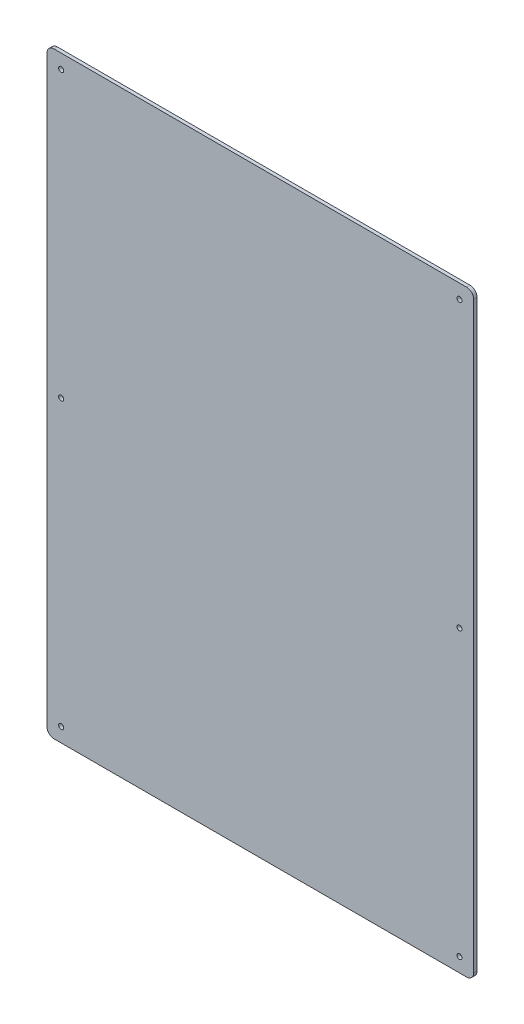
ISO-10303-21;
HEADER;
FILE_DESCRIPTION(('STEP AP214'),'2;1');
FILE_NAME('part.step','',(''),(''),'','','');
FILE_SCHEMA(('AUTOMOTIVE_DESIGN { 1 0 10303 214 1 1 1 1 }'));
ENDSEC;
DATA;
#1=APPLICATION_CONTEXT('core data for automotive mechanical design processes');
#2=APPLICATION_PROTOCOL_DEFINITION('international standard','automotive_design',2000,#1);
#3=PRODUCT_CONTEXT('',#1,'mechanical');
#4=PRODUCT('Part','Part','',(#3));
#5=PRODUCT_RELATED_PRODUCT_CATEGORY('part','',(#4));
#6=PRODUCT_DEFINITION_FORMATION('','',#4);
#7=PRODUCT_DEFINITION_CONTEXT('part definition',#1,'design');
#8=PRODUCT_DEFINITION('design','',#6,#7);
#9=PRODUCT_DEFINITION_SHAPE('','',#8);
#10=(LENGTH_UNIT() NAMED_UNIT(*) SI_UNIT(.MILLI.,.METRE.));
#11=(NAMED_UNIT(*) PLANE_ANGLE_UNIT() SI_UNIT($,.RADIAN.));
#12=(NAMED_UNIT(*) SI_UNIT($,.STERADIAN.) SOLID_ANGLE_UNIT());
#13=UNCERTAINTY_MEASURE_WITH_UNIT(LENGTH_MEASURE(1.E-05),#10,'distance_accuracy_value','');
#14=(GEOMETRIC_REPRESENTATION_CONTEXT(3) GLOBAL_UNCERTAINTY_ASSIGNED_CONTEXT((#13)) GLOBAL_UNIT_ASSIGNED_CONTEXT((#10,
#11,#12)) REPRESENTATION_CONTEXT('',''));
#15=CARTESIAN_POINT('',(0.,0.,0.));
#16=DIRECTION('',(0.,0.,1.));
#17=DIRECTION('',(1.,0.,0.));
#18=AXIS2_PLACEMENT_3D('',#15,#16,#17);
#19=CARTESIAN_POINT('',(-8.93704227221994,7.193965099171,3.048));
#20=DIRECTION('',(1.,0.,0.));
#21=DIRECTION('',(0.,1.,0.));
#22=AXIS2_PLACEMENT_3D('',#19,#20,#21);
#23=PLANE('',#22);
#24=DIRECTION('',(0.,-1.,0.));
#25=VECTOR('',#24,1.);
#26=CARTESIAN_POINT('',(-8.93704227221994,7.193965099171,0.));
#27=LINE('',#26,#25);
#28=CARTESIAN_POINT('',(-8.93704227221994,0.843965099170999,0.));
#29=VERTEX_POINT('',#28);
#30=CARTESIAN_POINT('',(-8.93704227221988,-519.856034900829,0.));
#31=VERTEX_POINT('',#30);
#32=EDGE_CURVE('E133',#29,#31,#27,.T.);
#33=ORIENTED_EDGE('',*,*,#32,.T.);
#34=DIRECTION('',(0.,0.,-1.));
#35=VECTOR('',#34,1.);
#36=CARTESIAN_POINT('',(-8.93704227221988,-519.856034900829,3.048));
#37=LINE('',#36,#35);
#38=CARTESIAN_POINT('',(-8.93704227221988,-519.856034900829,3.048));
#39=VERTEX_POINT('',#38);
#40=EDGE_CURVE('E111',#31,#39,#37,.F.);
#41=ORIENTED_EDGE('',*,*,#40,.T.);
#42=DIRECTION('',(0.,-1.,0.));
#43=VECTOR('',#42,1.);
#44=CARTESIAN_POINT('',(-8.93704227221994,7.193965099171,3.048));
#45=LINE('',#44,#43);
#46=CARTESIAN_POINT('',(-8.93704227221994,0.843965099170999,3.048));
#47=VERTEX_POINT('',#46);
#48=EDGE_CURVE('E143',#47,#39,#45,.T.);
#49=ORIENTED_EDGE('',*,*,#48,.F.);
#50=DIRECTION('',(0.,0.,-1.));
#51=VECTOR('',#50,1.);
#52=CARTESIAN_POINT('',(-8.93704227221994,0.843965099170999,3.048));
#53=LINE('',#52,#51);
#54=EDGE_CURVE('E116',#47,#29,#53,.T.);
#55=ORIENTED_EDGE('',*,*,#54,.T.);
#56=EDGE_LOOP('',(#33,#41,#49,#55));
#57=FACE_BOUND('',#56,.T.);
#58=ADVANCED_FACE('F38',(#57),#23,.F.);
#59=CARTESIAN_POINT('',(-8.93704227221988,-526.206034900829,3.048));
#60=DIRECTION('',(0.,1.,0.));
#61=DIRECTION('',(0.,0.,1.));
#62=AXIS2_PLACEMENT_3D('',#59,#60,#61);
#63=PLANE('',#62);
#64=DIRECTION('',(1.,0.,0.));
#65=VECTOR('',#64,1.);
#66=CARTESIAN_POINT('',(-8.93704227221988,-526.206034900829,3.048));
#67=LINE('',#66,#65);
#68=CARTESIAN_POINT('',(-2.58704227221988,-526.206034900829,3.048));
#69=VERTEX_POINT('',#68);
#70=CARTESIAN_POINT('',(365.71295772778,-526.206034900829,3.048));
#71=VERTEX_POINT('',#70);
#72=EDGE_CURVE('E126',#69,#71,#67,.T.);
#73=ORIENTED_EDGE('',*,*,#72,.F.);
#74=DIRECTION('',(0.,0.,-1.));
#75=VECTOR('',#74,1.);
#76=CARTESIAN_POINT('',(-2.58704227221988,-526.206034900829,3.048));
#77=LINE('',#76,#75);
#78=CARTESIAN_POINT('',(-2.58704227221988,-526.206034900829,0.));
#79=VERTEX_POINT('',#78);
#80=EDGE_CURVE('E110',#69,#79,#77,.T.);
#81=ORIENTED_EDGE('',*,*,#80,.T.);
#82=DIRECTION('',(1.,0.,0.));
#83=VECTOR('',#82,1.);
#84=CARTESIAN_POINT('',(-8.93704227221988,-526.206034900829,0.));
#85=LINE('',#84,#83);
#86=CARTESIAN_POINT('',(365.71295772778,-526.206034900829,0.));
#87=VERTEX_POINT('',#86);
#88=EDGE_CURVE('E123',#79,#87,#85,.T.);
#89=ORIENTED_EDGE('',*,*,#88,.T.);
#90=DIRECTION('',(0.,0.,-1.));
#91=VECTOR('',#90,1.);
#92=CARTESIAN_POINT('',(365.71295772778,-526.206034900829,3.048));
#93=LINE('',#92,#91);
#94=EDGE_CURVE('E128',#87,#71,#93,.F.);
#95=ORIENTED_EDGE('',*,*,#94,.T.);
#96=EDGE_LOOP('',(#73,#81,#89,#95));
#97=FACE_BOUND('',#96,.T.);
#98=ADVANCED_FACE('F122',(#97),#63,.F.);
#99=CARTESIAN_POINT('',(372.06295772778,7.193965099171,3.048));
#100=DIRECTION('',(-1.,0.,0.));
#101=DIRECTION('',(0.,-1.,0.));
#102=AXIS2_PLACEMENT_3D('',#99,#100,#101);
#103=PLANE('',#102);
#104=DIRECTION('',(0.,1.,0.));
#105=VECTOR('',#104,1.);
#106=CARTESIAN_POINT('',(372.06295772778,7.193965099171,3.048));
#107=LINE('',#106,#105);
#108=CARTESIAN_POINT('',(372.06295772778,-519.856034900829,3.048));
#109=VERTEX_POINT('',#108);
#110=CARTESIAN_POINT('',(372.06295772778,0.843965099171001,3.048));
#111=VERTEX_POINT('',#110);
#112=EDGE_CURVE('E204',#109,#111,#107,.T.);
#113=ORIENTED_EDGE('',*,*,#112,.F.);
#114=DIRECTION('',(0.,0.,-1.));
#115=VECTOR('',#114,1.);
#116=CARTESIAN_POINT('',(372.06295772778,-519.856034900829,3.048));
#117=LINE('',#116,#115);
#118=CARTESIAN_POINT('',(372.06295772778,-519.856034900829,0.));
#119=VERTEX_POINT('',#118);
#120=EDGE_CURVE('E162',#109,#119,#117,.T.);
#121=ORIENTED_EDGE('',*,*,#120,.T.);
#122=DIRECTION('',(0.,1.,0.));
#123=VECTOR('',#122,1.);
#124=CARTESIAN_POINT('',(372.06295772778,7.193965099171,0.));
#125=LINE('',#124,#123);
#126=CARTESIAN_POINT('',(372.06295772778,0.843965099171001,0.));
#127=VERTEX_POINT('',#126);
#128=EDGE_CURVE('E132',#119,#127,#125,.T.);
#129=ORIENTED_EDGE('',*,*,#128,.T.);
#130=DIRECTION('',(0.,0.,-1.));
#131=VECTOR('',#130,1.);
#132=CARTESIAN_POINT('',(372.06295772778,0.843965099171001,3.048));
#133=LINE('',#132,#131);
#134=EDGE_CURVE('E160',#127,#111,#133,.F.);
#135=ORIENTED_EDGE('',*,*,#134,.T.);
#136=EDGE_LOOP('',(#113,#121,#129,#135));
#137=FACE_BOUND('',#136,.T.);
#138=ADVANCED_FACE('F219',(#137),#103,.F.);
#139=CARTESIAN_POINT('',(-8.93704227221994,7.193965099171,3.048));
#140=DIRECTION('',(0.,-1.,0.));
#141=DIRECTION('',(0.,0.,-1.));
#142=AXIS2_PLACEMENT_3D('',#139,#140,#141);
#143=PLANE('',#142);
#144=DIRECTION('',(-1.,0.,0.));
#145=VECTOR('',#144,1.);
#146=CARTESIAN_POINT('',(-8.93704227221994,7.193965099171,3.048));
#147=LINE('',#146,#145);
#148=CARTESIAN_POINT('',(365.71295772778,7.193965099171,3.048));
#149=VERTEX_POINT('',#148);
#150=CARTESIAN_POINT('',(-2.58704227221994,7.193965099171,3.048));
#151=VERTEX_POINT('',#150);
#152=EDGE_CURVE('E144',#149,#151,#147,.T.);
#153=ORIENTED_EDGE('',*,*,#152,.F.);
#154=DIRECTION('',(0.,0.,-1.));
#155=VECTOR('',#154,1.);
#156=CARTESIAN_POINT('',(365.71295772778,7.193965099171,3.048));
#157=LINE('',#156,#155);
#158=CARTESIAN_POINT('',(365.71295772778,7.193965099171,0.));
#159=VERTEX_POINT('',#158);
#160=EDGE_CURVE('E11',#149,#159,#157,.T.);
#161=ORIENTED_EDGE('',*,*,#160,.T.);
#162=DIRECTION('',(-1.,0.,0.));
#163=VECTOR('',#162,1.);
#164=CARTESIAN_POINT('',(-8.93704227221994,7.193965099171,0.));
#165=LINE('',#164,#163);
#166=CARTESIAN_POINT('',(-2.58704227221994,7.193965099171,0.));
#167=VERTEX_POINT('',#166);
#168=EDGE_CURVE('E136',#159,#167,#165,.T.);
#169=ORIENTED_EDGE('',*,*,#168,.T.);
#170=DIRECTION('',(0.,0.,-1.));
#171=VECTOR('',#170,1.);
#172=CARTESIAN_POINT('',(-2.58704227221994,7.193965099171,3.048));
#173=LINE('',#172,#171);
#174=EDGE_CURVE('E47',#167,#151,#173,.F.);
#175=ORIENTED_EDGE('',*,*,#174,.T.);
#176=EDGE_LOOP('',(#153,#161,#169,#175));
#177=FACE_BOUND('',#176,.T.);
#178=ADVANCED_FACE('F213',(#177),#143,.F.);
#179=CARTESIAN_POINT('',(0.,0.,3.048));
#180=DIRECTION('',(0.,0.,1.));
#181=DIRECTION('',(1.,0.,0.));
#182=AXIS2_PLACEMENT_3D('',#179,#180,#181);
#183=PLANE('',#182);
#184=CARTESIAN_POINT('',(3.76295772778018,-5.506034900829,3.048));
#185=DIRECTION('',(0.,0.,1.));
#186=DIRECTION('',(1.,0.,0.));
#187=AXIS2_PLACEMENT_3D('',#184,#185,#186);
#188=CIRCLE('',#187,2.2479);
#189=CARTESIAN_POINT('',(6.01085772778018,-5.506034900829,3.048));
#190=VERTEX_POINT('',#189);
#191=EDGE_CURVE('E184',#190,#190,#188,.T.);
#192=ORIENTED_EDGE('',*,*,#191,.F.);
#193=EDGE_LOOP('',(#192));
#194=FACE_BOUND('',#193,.T.);
#195=CARTESIAN_POINT('',(3.76295772778021,-259.506034900829,3.048));
#196=DIRECTION('',(0.,0.,1.));
#197=DIRECTION('',(1.,0.,0.));
#198=AXIS2_PLACEMENT_3D('',#195,#196,#197);
#199=CIRCLE('',#198,2.2479);
#200=CARTESIAN_POINT('',(6.01085772778021,-259.506034900829,3.048));
#201=VERTEX_POINT('',#200);
#202=EDGE_CURVE('E173',#201,#201,#199,.T.);
#203=ORIENTED_EDGE('',*,*,#202,.F.);
#204=EDGE_LOOP('',(#203));
#205=FACE_BOUND('',#204,.T.);
#206=CARTESIAN_POINT('',(3.76295772778024,-513.506034900829,3.048));
#207=DIRECTION('',(0.,0.,1.));
#208=DIRECTION('',(1.,0.,0.));
#209=AXIS2_PLACEMENT_3D('',#206,#207,#208);
#210=CIRCLE('',#209,2.2479);
#211=CARTESIAN_POINT('',(6.01085772778024,-513.506034900829,3.048));
#212=VERTEX_POINT('',#211);
#213=EDGE_CURVE('E172',#212,#212,#210,.T.);
#214=ORIENTED_EDGE('',*,*,#213,.F.);
#215=EDGE_LOOP('',(#214));
#216=FACE_BOUND('',#215,.T.);
#217=CARTESIAN_POINT('',(359.36295772778,-513.506034900829,3.048));
#218=DIRECTION('',(0.,0.,1.));
#219=DIRECTION('',(1.,0.,0.));
#220=AXIS2_PLACEMENT_3D('',#217,#218,#219);
#221=CIRCLE('',#220,2.24790000000002);
#222=CARTESIAN_POINT('',(361.61085772778,-513.506034900829,3.048));
#223=VERTEX_POINT('',#222);
#224=EDGE_CURVE('E169',#223,#223,#221,.T.);
#225=ORIENTED_EDGE('',*,*,#224,.F.);
#226=EDGE_LOOP('',(#225));
#227=FACE_BOUND('',#226,.T.);
#228=CARTESIAN_POINT('',(359.36295772778,-259.506034900829,3.048));
#229=DIRECTION('',(0.,0.,1.));
#230=DIRECTION('',(1.,0.,0.));
#231=AXIS2_PLACEMENT_3D('',#228,#229,#230);
#232=CIRCLE('',#231,2.24790000000002);
#233=CARTESIAN_POINT('',(361.61085772778,-259.506034900829,3.048));
#234=VERTEX_POINT('',#233);
#235=EDGE_CURVE('E168',#234,#234,#232,.T.);
#236=ORIENTED_EDGE('',*,*,#235,.F.);
#237=EDGE_LOOP('',(#236));
#238=FACE_BOUND('',#237,.T.);
#239=CARTESIAN_POINT('',(359.36295772778,-5.506034900829,3.048));
#240=DIRECTION('',(0.,0.,1.));
#241=DIRECTION('',(1.,0.,0.));
#242=AXIS2_PLACEMENT_3D('',#239,#240,#241);
#243=CIRCLE('',#242,2.24790000000002);
#244=CARTESIAN_POINT('',(361.61085772778,-5.506034900829,3.048));
#245=VERTEX_POINT('',#244);
#246=EDGE_CURVE('E196',#245,#245,#243,.T.);
#247=ORIENTED_EDGE('',*,*,#246,.F.);
#248=EDGE_LOOP('',(#247));
#249=FACE_BOUND('',#248,.T.);
#250=ORIENTED_EDGE('',*,*,#48,.T.);
#251=CARTESIAN_POINT('',(-2.58704227221988,-519.856034900829,3.048));
#252=DIRECTION('',(0.,0.,1.));
#253=DIRECTION('',(1.,0.,0.));
#254=AXIS2_PLACEMENT_3D('',#251,#252,#253);
#255=CIRCLE('',#254,6.35);
#256=EDGE_CURVE('E158',#39,#69,#255,.T.);
#257=ORIENTED_EDGE('',*,*,#256,.T.);
#258=ORIENTED_EDGE('',*,*,#72,.T.);
#259=CARTESIAN_POINT('',(365.71295772778,-519.856034900829,3.048));
#260=DIRECTION('',(0.,0.,1.));
#261=DIRECTION('',(1.,0.,0.));
#262=AXIS2_PLACEMENT_3D('',#259,#260,#261);
#263=CIRCLE('',#262,6.35);
#264=EDGE_CURVE('E156',#71,#109,#263,.T.);
#265=ORIENTED_EDGE('',*,*,#264,.T.);
#266=ORIENTED_EDGE('',*,*,#112,.T.);
#267=CARTESIAN_POINT('',(365.71295772778,0.843965099171,3.048));
#268=DIRECTION('',(0.,0.,1.));
#269=DIRECTION('',(1.,0.,0.));
#270=AXIS2_PLACEMENT_3D('',#267,#268,#269);
#271=CIRCLE('',#270,6.35);
#272=EDGE_CURVE('E61',#111,#149,#271,.T.);
#273=ORIENTED_EDGE('',*,*,#272,.T.);
#274=ORIENTED_EDGE('',*,*,#152,.T.);
#275=CARTESIAN_POINT('',(-2.58704227221994,0.843965099171,3.048));
#276=DIRECTION('',(0.,0.,1.));
#277=DIRECTION('',(1.,0.,0.));
#278=AXIS2_PLACEMENT_3D('',#275,#276,#277);
#279=CIRCLE('',#278,6.35);
#280=EDGE_CURVE('E153',#151,#47,#279,.T.);
#281=ORIENTED_EDGE('',*,*,#280,.T.);
#282=EDGE_LOOP('',(#250,#257,#258,#265,#266,#273,#274,#281));
#283=FACE_BOUND('',#282,.T.);
#284=ADVANCED_FACE('F206',(#194,#205,#216,#227,#238,#249,#283),#183,.T.);
#285=CARTESIAN_POINT('',(0.,0.,0.));
#286=DIRECTION('',(0.,0.,1.));
#287=DIRECTION('',(1.,0.,0.));
#288=AXIS2_PLACEMENT_3D('',#285,#286,#287);
#289=PLANE('',#288);
#290=CARTESIAN_POINT('',(3.76295772778018,-5.506034900829,0.));
#291=DIRECTION('',(0.,0.,1.));
#292=DIRECTION('',(1.,0.,0.));
#293=AXIS2_PLACEMENT_3D('',#290,#291,#292);
#294=CIRCLE('',#293,2.2479);
#295=CARTESIAN_POINT('',(6.01085772778018,-5.506034900829,0.));
#296=VERTEX_POINT('',#295);
#297=EDGE_CURVE('E42',#296,#296,#294,.T.);
#298=ORIENTED_EDGE('',*,*,#297,.T.);
#299=EDGE_LOOP('',(#298));
#300=FACE_BOUND('',#299,.T.);
#301=CARTESIAN_POINT('',(3.76295772778021,-259.506034900829,0.));
#302=DIRECTION('',(0.,0.,1.));
#303=DIRECTION('',(1.,0.,0.));
#304=AXIS2_PLACEMENT_3D('',#301,#302,#303);
#305=CIRCLE('',#304,2.2479);
#306=CARTESIAN_POINT('',(6.01085772778021,-259.506034900829,0.));
#307=VERTEX_POINT('',#306);
#308=EDGE_CURVE('E170',#307,#307,#305,.T.);
#309=ORIENTED_EDGE('',*,*,#308,.T.);
#310=EDGE_LOOP('',(#309));
#311=FACE_BOUND('',#310,.T.);
#312=CARTESIAN_POINT('',(3.76295772778024,-513.506034900829,0.));
#313=DIRECTION('',(0.,0.,1.));
#314=DIRECTION('',(1.,0.,0.));
#315=AXIS2_PLACEMENT_3D('',#312,#313,#314);
#316=CIRCLE('',#315,2.2479);
#317=CARTESIAN_POINT('',(6.01085772778024,-513.506034900829,0.));
#318=VERTEX_POINT('',#317);
#319=EDGE_CURVE('E177',#318,#318,#316,.T.);
#320=ORIENTED_EDGE('',*,*,#319,.T.);
#321=EDGE_LOOP('',(#320));
#322=FACE_BOUND('',#321,.T.);
#323=CARTESIAN_POINT('',(359.36295772778,-513.506034900829,0.));
#324=DIRECTION('',(0.,0.,1.));
#325=DIRECTION('',(1.,0.,0.));
#326=AXIS2_PLACEMENT_3D('',#323,#324,#325);
#327=CIRCLE('',#326,2.24790000000002);
#328=CARTESIAN_POINT('',(361.61085772778,-513.506034900829,0.));
#329=VERTEX_POINT('',#328);
#330=EDGE_CURVE('E166',#329,#329,#327,.T.);
#331=ORIENTED_EDGE('',*,*,#330,.T.);
#332=EDGE_LOOP('',(#331));
#333=FACE_BOUND('',#332,.T.);
#334=CARTESIAN_POINT('',(359.36295772778,-259.506034900829,0.));
#335=DIRECTION('',(0.,0.,1.));
#336=DIRECTION('',(1.,0.,0.));
#337=AXIS2_PLACEMENT_3D('',#334,#335,#336);
#338=CIRCLE('',#337,2.24790000000002);
#339=CARTESIAN_POINT('',(361.61085772778,-259.506034900829,0.));
#340=VERTEX_POINT('',#339);
#341=EDGE_CURVE('E193',#340,#340,#338,.T.);
#342=ORIENTED_EDGE('',*,*,#341,.T.);
#343=EDGE_LOOP('',(#342));
#344=FACE_BOUND('',#343,.T.);
#345=CARTESIAN_POINT('',(359.36295772778,-5.506034900829,0.));
#346=DIRECTION('',(0.,0.,1.));
#347=DIRECTION('',(1.,0.,0.));
#348=AXIS2_PLACEMENT_3D('',#345,#346,#347);
#349=CIRCLE('',#348,2.24790000000002);
#350=CARTESIAN_POINT('',(361.61085772778,-5.506034900829,0.));
#351=VERTEX_POINT('',#350);
#352=EDGE_CURVE('E138',#351,#351,#349,.T.);
#353=ORIENTED_EDGE('',*,*,#352,.T.);
#354=EDGE_LOOP('',(#353));
#355=FACE_BOUND('',#354,.T.);
#356=ORIENTED_EDGE('',*,*,#88,.F.);
#357=CARTESIAN_POINT('',(-2.58704227221988,-519.856034900829,0.));
#358=DIRECTION('',(0.,0.,1.));
#359=DIRECTION('',(1.,0.,0.));
#360=AXIS2_PLACEMENT_3D('',#357,#358,#359);
#361=CIRCLE('',#360,6.35);
#362=EDGE_CURVE('E106',#79,#31,#361,.F.);
#363=ORIENTED_EDGE('',*,*,#362,.T.);
#364=ORIENTED_EDGE('',*,*,#32,.F.);
#365=CARTESIAN_POINT('',(-2.58704227221994,0.843965099171,0.));
#366=DIRECTION('',(0.,0.,1.));
#367=DIRECTION('',(1.,0.,0.));
#368=AXIS2_PLACEMENT_3D('',#365,#366,#367);
#369=CIRCLE('',#368,6.35);
#370=EDGE_CURVE('E127',#29,#167,#369,.F.);
#371=ORIENTED_EDGE('',*,*,#370,.T.);
#372=ORIENTED_EDGE('',*,*,#168,.F.);
#373=CARTESIAN_POINT('',(365.71295772778,0.843965099171,0.));
#374=DIRECTION('',(0.,0.,1.));
#375=DIRECTION('',(1.,0.,0.));
#376=AXIS2_PLACEMENT_3D('',#373,#374,#375);
#377=CIRCLE('',#376,6.35);
#378=EDGE_CURVE('E147',#159,#127,#377,.F.);
#379=ORIENTED_EDGE('',*,*,#378,.T.);
#380=ORIENTED_EDGE('',*,*,#128,.F.);
#381=CARTESIAN_POINT('',(365.71295772778,-519.856034900829,0.));
#382=DIRECTION('',(0.,0.,1.));
#383=DIRECTION('',(1.,0.,0.));
#384=AXIS2_PLACEMENT_3D('',#381,#382,#383);
#385=CIRCLE('',#384,6.35);
#386=EDGE_CURVE('E117',#119,#87,#385,.F.);
#387=ORIENTED_EDGE('',*,*,#386,.T.);
#388=EDGE_LOOP('',(#356,#363,#364,#371,#372,#379,#380,#387));
#389=FACE_BOUND('',#388,.T.);
#390=ADVANCED_FACE('F130',(#300,#311,#322,#333,#344,#355,#389),#289,.F.);
#391=CARTESIAN_POINT('',(-2.58704227221988,-519.856034900829,3.048));
#392=DIRECTION('',(0.,0.,-1.));
#393=DIRECTION('',(-1.,0.,0.));
#394=AXIS2_PLACEMENT_3D('',#391,#392,#393);
#395=CYLINDRICAL_SURFACE('',#394,6.35);
#396=ORIENTED_EDGE('',*,*,#256,.F.);
#397=ORIENTED_EDGE('',*,*,#40,.F.);
#398=ORIENTED_EDGE('',*,*,#362,.F.);
#399=ORIENTED_EDGE('',*,*,#80,.F.);
#400=EDGE_LOOP('',(#396,#397,#398,#399));
#401=FACE_BOUND('',#400,.T.);
#402=ADVANCED_FACE('F109',(#401),#395,.T.);
#403=CARTESIAN_POINT('',(365.71295772778,-519.856034900829,3.048));
#404=DIRECTION('',(0.,0.,-1.));
#405=DIRECTION('',(-1.,0.,0.));
#406=AXIS2_PLACEMENT_3D('',#403,#404,#405);
#407=CYLINDRICAL_SURFACE('',#406,6.35);
#408=ORIENTED_EDGE('',*,*,#264,.F.);
#409=ORIENTED_EDGE('',*,*,#94,.F.);
#410=ORIENTED_EDGE('',*,*,#386,.F.);
#411=ORIENTED_EDGE('',*,*,#120,.F.);
#412=EDGE_LOOP('',(#408,#409,#410,#411));
#413=FACE_BOUND('',#412,.T.);
#414=ADVANCED_FACE('F223',(#413),#407,.T.);
#415=CARTESIAN_POINT('',(365.71295772778,0.843965099171,3.048));
#416=DIRECTION('',(0.,0.,-1.));
#417=DIRECTION('',(-1.,0.,0.));
#418=AXIS2_PLACEMENT_3D('',#415,#416,#417);
#419=CYLINDRICAL_SURFACE('',#418,6.35);
#420=ORIENTED_EDGE('',*,*,#272,.F.);
#421=ORIENTED_EDGE('',*,*,#134,.F.);
#422=ORIENTED_EDGE('',*,*,#378,.F.);
#423=ORIENTED_EDGE('',*,*,#160,.F.);
#424=EDGE_LOOP('',(#420,#421,#422,#423));
#425=FACE_BOUND('',#424,.T.);
#426=ADVANCED_FACE('F215',(#425),#419,.T.);
#427=CARTESIAN_POINT('',(-2.58704227221994,0.843965099171,3.048));
#428=DIRECTION('',(0.,0.,-1.));
#429=DIRECTION('',(-1.,0.,0.));
#430=AXIS2_PLACEMENT_3D('',#427,#428,#429);
#431=CYLINDRICAL_SURFACE('',#430,6.35);
#432=ORIENTED_EDGE('',*,*,#280,.F.);
#433=ORIENTED_EDGE('',*,*,#174,.F.);
#434=ORIENTED_EDGE('',*,*,#370,.F.);
#435=ORIENTED_EDGE('',*,*,#54,.F.);
#436=EDGE_LOOP('',(#432,#433,#434,#435));
#437=FACE_BOUND('',#436,.T.);
#438=ADVANCED_FACE('F40',(#437),#431,.T.);
#439=CARTESIAN_POINT('',(359.36295772778,-5.506034900829,3.048));
#440=DIRECTION('',(0.,0.,1.));
#441=DIRECTION('',(1.,0.,0.));
#442=AXIS2_PLACEMENT_3D('',#439,#440,#441);
#443=CYLINDRICAL_SURFACE('',#442,2.24790000000002);
#444=ORIENTED_EDGE('',*,*,#246,.T.);
#445=EDGE_LOOP('',(#444));
#446=FACE_BOUND('',#445,.T.);
#447=ORIENTED_EDGE('',*,*,#352,.F.);
#448=EDGE_LOOP('',(#447));
#449=FACE_BOUND('',#448,.T.);
#450=ADVANCED_FACE('F248',(#446,#449),#443,.F.);
#451=CARTESIAN_POINT('',(359.36295772778,-259.506034900829,3.048));
#452=DIRECTION('',(0.,0.,1.));
#453=DIRECTION('',(1.,0.,0.));
#454=AXIS2_PLACEMENT_3D('',#451,#452,#453);
#455=CYLINDRICAL_SURFACE('',#454,2.24790000000002);
#456=ORIENTED_EDGE('',*,*,#235,.T.);
#457=EDGE_LOOP('',(#456));
#458=FACE_BOUND('',#457,.T.);
#459=ORIENTED_EDGE('',*,*,#341,.F.);
#460=EDGE_LOOP('',(#459));
#461=FACE_BOUND('',#460,.T.);
#462=ADVANCED_FACE('F251',(#458,#461),#455,.F.);
#463=CARTESIAN_POINT('',(359.36295772778,-513.506034900829,3.048));
#464=DIRECTION('',(0.,0.,1.));
#465=DIRECTION('',(1.,0.,0.));
#466=AXIS2_PLACEMENT_3D('',#463,#464,#465);
#467=CYLINDRICAL_SURFACE('',#466,2.24790000000002);
#468=ORIENTED_EDGE('',*,*,#224,.T.);
#469=EDGE_LOOP('',(#468));
#470=FACE_BOUND('',#469,.T.);
#471=ORIENTED_EDGE('',*,*,#330,.F.);
#472=EDGE_LOOP('',(#471));
#473=FACE_BOUND('',#472,.T.);
#474=ADVANCED_FACE('F255',(#470,#473),#467,.F.);
#475=CARTESIAN_POINT('',(3.76295772778024,-513.506034900829,3.048));
#476=DIRECTION('',(0.,0.,1.));
#477=DIRECTION('',(1.,0.,0.));
#478=AXIS2_PLACEMENT_3D('',#475,#476,#477);
#479=CYLINDRICAL_SURFACE('',#478,2.2479);
#480=ORIENTED_EDGE('',*,*,#213,.T.);
#481=EDGE_LOOP('',(#480));
#482=FACE_BOUND('',#481,.T.);
#483=ORIENTED_EDGE('',*,*,#319,.F.);
#484=EDGE_LOOP('',(#483));
#485=FACE_BOUND('',#484,.T.);
#486=ADVANCED_FACE('F259',(#482,#485),#479,.F.);
#487=CARTESIAN_POINT('',(3.76295772778021,-259.506034900829,3.048));
#488=DIRECTION('',(0.,0.,1.));
#489=DIRECTION('',(1.,0.,0.));
#490=AXIS2_PLACEMENT_3D('',#487,#488,#489);
#491=CYLINDRICAL_SURFACE('',#490,2.2479);
#492=ORIENTED_EDGE('',*,*,#202,.T.);
#493=EDGE_LOOP('',(#492));
#494=FACE_BOUND('',#493,.T.);
#495=ORIENTED_EDGE('',*,*,#308,.F.);
#496=EDGE_LOOP('',(#495));
#497=FACE_BOUND('',#496,.T.);
#498=ADVANCED_FACE('F263',(#494,#497),#491,.F.);
#499=CARTESIAN_POINT('',(3.76295772778018,-5.506034900829,3.048));
#500=DIRECTION('',(0.,0.,1.));
#501=DIRECTION('',(1.,0.,0.));
#502=AXIS2_PLACEMENT_3D('',#499,#500,#501);
#503=CYLINDRICAL_SURFACE('',#502,2.2479);
#504=ORIENTED_EDGE('',*,*,#191,.T.);
#505=EDGE_LOOP('',(#504));
#506=FACE_BOUND('',#505,.T.);
#507=ORIENTED_EDGE('',*,*,#297,.F.);
#508=EDGE_LOOP('',(#507));
#509=FACE_BOUND('',#508,.T.);
#510=ADVANCED_FACE('F267',(#506,#509),#503,.F.);
#511=CLOSED_SHELL('',(#58,#98,#138,#178,#284,#390,#402,#414,#426,#438,#450,#462,#474,#486,#498,#510));
#512=MANIFOLD_SOLID_BREP('B2',#511);
#513=ADVANCED_BREP_SHAPE_REPRESENTATION('',(#18,#512),#14);
#514=SHAPE_DEFINITION_REPRESENTATION(#9,#513);
ENDSEC;
END-ISO-10303-21;
